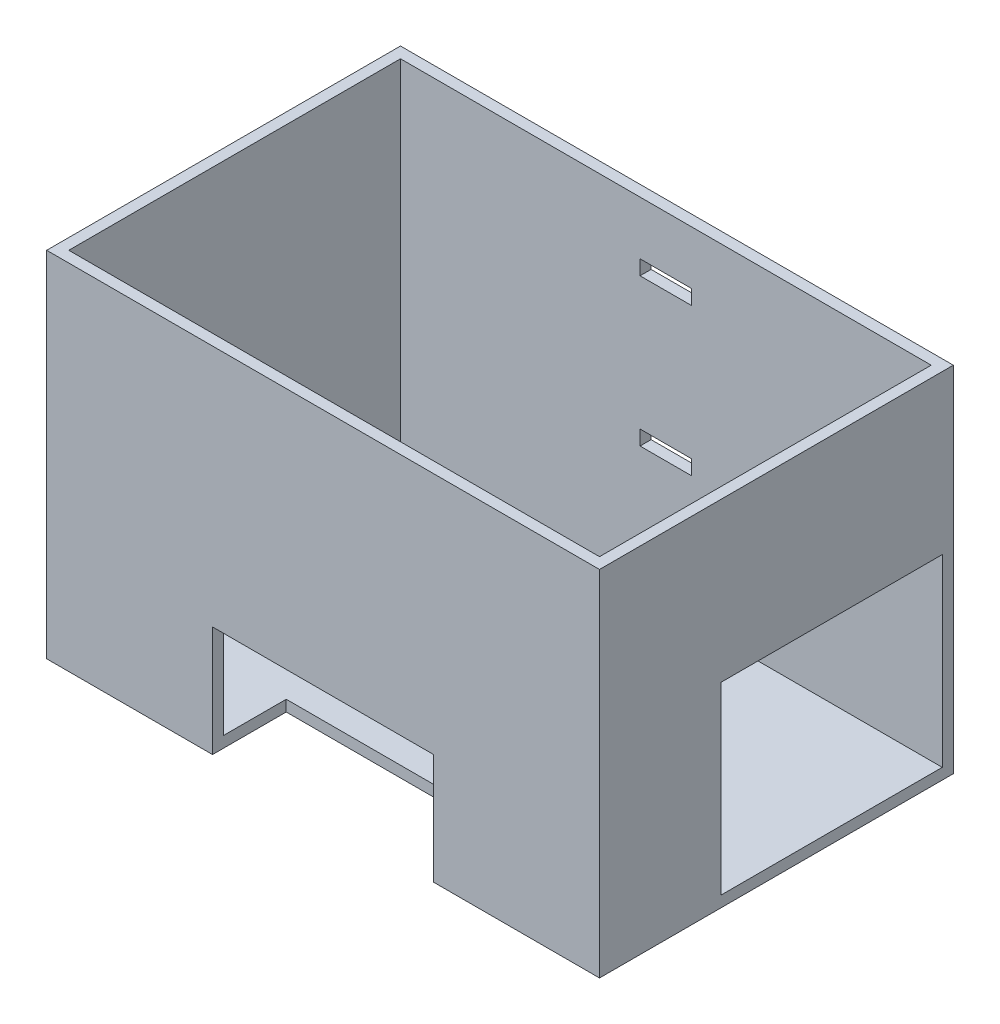
ISO-10303-21;
HEADER;
FILE_DESCRIPTION(('STEP AP214'),'2;1');
FILE_NAME('part.step','',(''),(''),'','','');
FILE_SCHEMA(('AUTOMOTIVE_DESIGN { 1 0 10303 214 1 1 1 1 }'));
ENDSEC;
DATA;
#1=APPLICATION_CONTEXT('core data for automotive mechanical design processes');
#2=APPLICATION_PROTOCOL_DEFINITION('international standard','automotive_design',2000,#1);
#3=PRODUCT_CONTEXT('',#1,'mechanical');
#4=PRODUCT('Part','Part','',(#3));
#5=PRODUCT_RELATED_PRODUCT_CATEGORY('part','',(#4));
#6=PRODUCT_DEFINITION_FORMATION('','',#4);
#7=PRODUCT_DEFINITION_CONTEXT('part definition',#1,'design');
#8=PRODUCT_DEFINITION('design','',#6,#7);
#9=PRODUCT_DEFINITION_SHAPE('','',#8);
#10=(LENGTH_UNIT() NAMED_UNIT(*) SI_UNIT(.MILLI.,.METRE.));
#11=(NAMED_UNIT(*) PLANE_ANGLE_UNIT() SI_UNIT($,.RADIAN.));
#12=(NAMED_UNIT(*) SI_UNIT($,.STERADIAN.) SOLID_ANGLE_UNIT());
#13=UNCERTAINTY_MEASURE_WITH_UNIT(LENGTH_MEASURE(1.E-05),#10,'distance_accuracy_value','');
#14=(GEOMETRIC_REPRESENTATION_CONTEXT(3) GLOBAL_UNCERTAINTY_ASSIGNED_CONTEXT((#13)) GLOBAL_UNIT_ASSIGNED_CONTEXT((#10,
#11,#12)) REPRESENTATION_CONTEXT('',''));
#15=CARTESIAN_POINT('',(0.,0.,0.));
#16=DIRECTION('',(0.,0.,1.));
#17=DIRECTION('',(1.,0.,0.));
#18=AXIS2_PLACEMENT_3D('',#15,#16,#17);
#19=CARTESIAN_POINT('',(0.,48.,0.));
#20=DIRECTION('',(0.,-1.,0.));
#21=DIRECTION('',(0.,0.,-1.));
#22=AXIS2_PLACEMENT_3D('',#19,#20,#21);
#23=PLANE('',#22);
#24=DIRECTION('',(0.,0.,1.));
#25=VECTOR('',#24,1.);
#26=CARTESIAN_POINT('',(0.,48.,0.));
#27=LINE('',#26,#25);
#28=CARTESIAN_POINT('',(0.,48.,-48.));
#29=VERTEX_POINT('',#28);
#30=CARTESIAN_POINT('',(0.,48.,0.));
#31=VERTEX_POINT('',#30);
#32=EDGE_CURVE('E381',#29,#31,#27,.T.);
#33=ORIENTED_EDGE('',*,*,#32,.T.);
#34=DIRECTION('',(1.,0.,0.));
#35=VECTOR('',#34,1.);
#36=CARTESIAN_POINT('',(0.,48.,0.));
#37=LINE('',#36,#35);
#38=CARTESIAN_POINT('',(75.,48.,0.));
#39=VERTEX_POINT('',#38);
#40=EDGE_CURVE('E384',#31,#39,#37,.T.);
#41=ORIENTED_EDGE('',*,*,#40,.T.);
#42=DIRECTION('',(0.,0.,-1.));
#43=VECTOR('',#42,1.);
#44=CARTESIAN_POINT('',(75.,48.,0.));
#45=LINE('',#44,#43);
#46=CARTESIAN_POINT('',(75.,48.,-48.));
#47=VERTEX_POINT('',#46);
#48=EDGE_CURVE('E387',#39,#47,#45,.T.);
#49=ORIENTED_EDGE('',*,*,#48,.T.);
#50=DIRECTION('',(-1.,0.,0.));
#51=VECTOR('',#50,1.);
#52=CARTESIAN_POINT('',(0.,48.,-48.));
#53=LINE('',#52,#51);
#54=EDGE_CURVE('E389',#47,#29,#53,.T.);
#55=ORIENTED_EDGE('',*,*,#54,.T.);
#56=EDGE_LOOP('',(#33,#41,#49,#55));
#57=FACE_BOUND('',#56,.T.);
#58=DIRECTION('',(0.,0.,1.));
#59=VECTOR('',#58,1.);
#60=CARTESIAN_POINT('',(1.5,48.,0.));
#61=LINE('',#60,#59);
#62=CARTESIAN_POINT('',(1.5,48.,-46.5));
#63=VERTEX_POINT('',#62);
#64=CARTESIAN_POINT('',(1.5,48.,-1.5));
#65=VERTEX_POINT('',#64);
#66=EDGE_CURVE('E373',#63,#65,#61,.T.);
#67=ORIENTED_EDGE('',*,*,#66,.F.);
#68=DIRECTION('',(-1.,0.,0.));
#69=VECTOR('',#68,1.);
#70=CARTESIAN_POINT('',(0.,48.,-46.5));
#71=LINE('',#70,#69);
#72=CARTESIAN_POINT('',(73.5,48.,-46.5));
#73=VERTEX_POINT('',#72);
#74=EDGE_CURVE('E361',#73,#63,#71,.T.);
#75=ORIENTED_EDGE('',*,*,#74,.F.);
#76=DIRECTION('',(0.,0.,-1.));
#77=VECTOR('',#76,1.);
#78=CARTESIAN_POINT('',(73.5,48.,0.));
#79=LINE('',#78,#77);
#80=CARTESIAN_POINT('',(73.5,48.,-1.5));
#81=VERTEX_POINT('',#80);
#82=EDGE_CURVE('E377',#81,#73,#79,.T.);
#83=ORIENTED_EDGE('',*,*,#82,.F.);
#84=DIRECTION('',(1.,0.,0.));
#85=VECTOR('',#84,1.);
#86=CARTESIAN_POINT('',(0.,48.,-1.5));
#87=LINE('',#86,#85);
#88=EDGE_CURVE('E375',#65,#81,#87,.T.);
#89=ORIENTED_EDGE('',*,*,#88,.F.);
#90=EDGE_LOOP('',(#67,#75,#83,#89));
#91=FACE_BOUND('',#90,.T.);
#92=ADVANCED_FACE('F40',(#57,#91),#23,.F.);
#93=CARTESIAN_POINT('',(0.,48.,0.));
#94=DIRECTION('',(1.,0.,0.));
#95=DIRECTION('',(0.,0.,-1.));
#96=AXIS2_PLACEMENT_3D('',#93,#94,#95);
#97=PLANE('',#96);
#98=DIRECTION('',(0.,0.,1.));
#99=VECTOR('',#98,1.);
#100=CARTESIAN_POINT('',(0.,1.5,-21.5));
#101=LINE('',#100,#99);
#102=CARTESIAN_POINT('',(0.,1.5,-21.5));
#103=VERTEX_POINT('',#102);
#104=CARTESIAN_POINT('',(0.,1.5,-1.5));
#105=VERTEX_POINT('',#104);
#106=EDGE_CURVE('E277',#103,#105,#101,.T.);
#107=ORIENTED_EDGE('',*,*,#106,.F.);
#108=DIRECTION('',(0.,-1.,0.));
#109=VECTOR('',#108,1.);
#110=CARTESIAN_POINT('',(0.,1.5,-21.5));
#111=LINE('',#110,#109);
#112=CARTESIAN_POINT('',(0.,26.5,-21.5));
#113=VERTEX_POINT('',#112);
#114=EDGE_CURVE('E255',#113,#103,#111,.T.);
#115=ORIENTED_EDGE('',*,*,#114,.F.);
#116=DIRECTION('',(0.,0.,-1.));
#117=VECTOR('',#116,1.);
#118=CARTESIAN_POINT('',(0.,26.5,-21.5));
#119=LINE('',#118,#117);
#120=CARTESIAN_POINT('',(0.,26.5,-1.5));
#121=VERTEX_POINT('',#120);
#122=EDGE_CURVE('E283',#121,#113,#119,.T.);
#123=ORIENTED_EDGE('',*,*,#122,.F.);
#124=DIRECTION('',(0.,1.,0.));
#125=VECTOR('',#124,1.);
#126=CARTESIAN_POINT('',(0.,1.5,-1.5));
#127=LINE('',#126,#125);
#128=EDGE_CURVE('E280',#105,#121,#127,.T.);
#129=ORIENTED_EDGE('',*,*,#128,.F.);
#130=EDGE_LOOP('',(#107,#115,#123,#129));
#131=FACE_BOUND('',#130,.T.);
#132=DIRECTION('',(0.,0.,1.));
#133=VECTOR('',#132,1.);
#134=CARTESIAN_POINT('',(0.,0.,0.));
#135=LINE('',#134,#133);
#136=CARTESIAN_POINT('',(0.,0.,-48.));
#137=VERTEX_POINT('',#136);
#138=CARTESIAN_POINT('',(0.,0.,0.));
#139=VERTEX_POINT('',#138);
#140=EDGE_CURVE('E355',#137,#139,#135,.T.);
#141=ORIENTED_EDGE('',*,*,#140,.T.);
#142=DIRECTION('',(0.,-1.,0.));
#143=VECTOR('',#142,1.);
#144=CARTESIAN_POINT('',(0.,48.,0.));
#145=LINE('',#144,#143);
#146=EDGE_CURVE('E409',#31,#139,#145,.T.);
#147=ORIENTED_EDGE('',*,*,#146,.F.);
#148=ORIENTED_EDGE('',*,*,#32,.F.);
#149=DIRECTION('',(0.,-1.,0.));
#150=VECTOR('',#149,1.);
#151=CARTESIAN_POINT('',(0.,48.,-48.));
#152=LINE('',#151,#150);
#153=EDGE_CURVE('E391',#29,#137,#152,.T.);
#154=ORIENTED_EDGE('',*,*,#153,.T.);
#155=EDGE_LOOP('',(#141,#147,#148,#154));
#156=FACE_BOUND('',#155,.T.);
#157=ADVANCED_FACE('F42',(#131,#156),#97,.F.);
#158=CARTESIAN_POINT('',(0.,48.,0.));
#159=DIRECTION('',(0.,0.,-1.));
#160=DIRECTION('',(-1.,0.,0.));
#161=AXIS2_PLACEMENT_3D('',#158,#159,#160);
#162=PLANE('',#161);
#163=DIRECTION('',(1.,0.,0.));
#164=VECTOR('',#163,1.);
#165=CARTESIAN_POINT('',(0.,0.,0.));
#166=LINE('',#165,#164);
#167=CARTESIAN_POINT('',(22.5,0.,0.));
#168=VERTEX_POINT('',#167);
#169=EDGE_CURVE('E395',#139,#168,#166,.T.);
#170=ORIENTED_EDGE('',*,*,#169,.T.);
#171=DIRECTION('',(0.,-1.,0.));
#172=VECTOR('',#171,1.);
#173=CARTESIAN_POINT('',(22.5,15.,0.));
#174=LINE('',#173,#172);
#175=CARTESIAN_POINT('',(22.5,15.,0.));
#176=VERTEX_POINT('',#175);
#177=EDGE_CURVE('E313',#176,#168,#174,.T.);
#178=ORIENTED_EDGE('',*,*,#177,.F.);
#179=DIRECTION('',(-1.,0.,0.));
#180=VECTOR('',#179,1.);
#181=CARTESIAN_POINT('',(22.5,15.,0.));
#182=LINE('',#181,#180);
#183=CARTESIAN_POINT('',(52.5,15.,0.));
#184=VERTEX_POINT('',#183);
#185=EDGE_CURVE('E304',#184,#176,#182,.T.);
#186=ORIENTED_EDGE('',*,*,#185,.F.);
#187=DIRECTION('',(0.,-1.,0.));
#188=VECTOR('',#187,1.);
#189=CARTESIAN_POINT('',(52.5,15.,0.));
#190=LINE('',#189,#188);
#191=CARTESIAN_POINT('',(52.5,0.,0.));
#192=VERTEX_POINT('',#191);
#193=EDGE_CURVE('E316',#184,#192,#190,.T.);
#194=ORIENTED_EDGE('',*,*,#193,.T.);
#195=CARTESIAN_POINT('',(75.,0.,0.));
#196=VERTEX_POINT('',#195);
#197=EDGE_CURVE('E394',#192,#196,#166,.T.);
#198=ORIENTED_EDGE('',*,*,#197,.T.);
#199=DIRECTION('',(0.,-1.,0.));
#200=VECTOR('',#199,1.);
#201=CARTESIAN_POINT('',(75.,48.,0.));
#202=LINE('',#201,#200);
#203=EDGE_CURVE('E406',#39,#196,#202,.T.);
#204=ORIENTED_EDGE('',*,*,#203,.F.);
#205=ORIENTED_EDGE('',*,*,#40,.F.);
#206=ORIENTED_EDGE('',*,*,#146,.T.);
#207=EDGE_LOOP('',(#170,#178,#186,#194,#198,#204,#205,#206));
#208=FACE_BOUND('',#207,.T.);
#209=ADVANCED_FACE('F462',(#208),#162,.F.);
#210=CARTESIAN_POINT('',(75.,48.,0.));
#211=DIRECTION('',(-1.,0.,0.));
#212=DIRECTION('',(0.,0.,1.));
#213=AXIS2_PLACEMENT_3D('',#210,#211,#212);
#214=PLANE('',#213);
#215=DIRECTION('',(0.,0.,-1.));
#216=VECTOR('',#215,1.);
#217=CARTESIAN_POINT('',(75.,1.5,-16.5));
#218=LINE('',#217,#216);
#219=CARTESIAN_POINT('',(75.,1.5,-16.5));
#220=VERTEX_POINT('',#219);
#221=CARTESIAN_POINT('',(75.,1.5,-46.5));
#222=VERTEX_POINT('',#221);
#223=EDGE_CURVE('E328',#220,#222,#218,.T.);
#224=ORIENTED_EDGE('',*,*,#223,.F.);
#225=DIRECTION('',(0.,-1.,0.));
#226=VECTOR('',#225,1.);
#227=CARTESIAN_POINT('',(75.,26.5,-16.5));
#228=LINE('',#227,#226);
#229=CARTESIAN_POINT('',(75.,26.5,-16.5));
#230=VERTEX_POINT('',#229);
#231=EDGE_CURVE('E326',#230,#220,#228,.T.);
#232=ORIENTED_EDGE('',*,*,#231,.F.);
#233=DIRECTION('',(0.,0.,1.));
#234=VECTOR('',#233,1.);
#235=CARTESIAN_POINT('',(75.,26.5,-16.5));
#236=LINE('',#235,#234);
#237=CARTESIAN_POINT('',(75.,26.5,-46.5));
#238=VERTEX_POINT('',#237);
#239=EDGE_CURVE('E334',#238,#230,#236,.T.);
#240=ORIENTED_EDGE('',*,*,#239,.F.);
#241=DIRECTION('',(0.,1.,0.));
#242=VECTOR('',#241,1.);
#243=CARTESIAN_POINT('',(75.,26.5,-46.5));
#244=LINE('',#243,#242);
#245=EDGE_CURVE('E331',#222,#238,#244,.T.);
#246=ORIENTED_EDGE('',*,*,#245,.F.);
#247=EDGE_LOOP('',(#224,#232,#240,#246));
#248=FACE_BOUND('',#247,.T.);
#249=DIRECTION('',(0.,0.,-1.));
#250=VECTOR('',#249,1.);
#251=CARTESIAN_POINT('',(75.,0.,0.));
#252=LINE('',#251,#250);
#253=CARTESIAN_POINT('',(75.,0.,-48.));
#254=VERTEX_POINT('',#253);
#255=EDGE_CURVE('E398',#196,#254,#252,.T.);
#256=ORIENTED_EDGE('',*,*,#255,.T.);
#257=DIRECTION('',(0.,-1.,0.));
#258=VECTOR('',#257,1.);
#259=CARTESIAN_POINT('',(75.,48.,-48.));
#260=LINE('',#259,#258);
#261=EDGE_CURVE('E403',#47,#254,#260,.T.);
#262=ORIENTED_EDGE('',*,*,#261,.F.);
#263=ORIENTED_EDGE('',*,*,#48,.F.);
#264=ORIENTED_EDGE('',*,*,#203,.T.);
#265=EDGE_LOOP('',(#256,#262,#263,#264));
#266=FACE_BOUND('',#265,.T.);
#267=ADVANCED_FACE('F476',(#248,#266),#214,.F.);
#268=CARTESIAN_POINT('',(0.,48.,-48.));
#269=DIRECTION('',(0.,0.,1.));
#270=DIRECTION('',(1.,0.,0.));
#271=AXIS2_PLACEMENT_3D('',#268,#269,#270);
#272=PLANE('',#271);
#273=DIRECTION('',(-1.,0.,0.));
#274=VECTOR('',#273,1.);
#275=CARTESIAN_POINT('',(41.,18.75,-48.));
#276=LINE('',#275,#274);
#277=CARTESIAN_POINT('',(41.,18.75,-48.));
#278=VERTEX_POINT('',#277);
#279=CARTESIAN_POINT('',(34.,18.75,-48.));
#280=VERTEX_POINT('',#279);
#281=EDGE_CURVE('E241',#278,#280,#276,.T.);
#282=ORIENTED_EDGE('',*,*,#281,.F.);
#283=DIRECTION('',(0.,-1.,0.));
#284=VECTOR('',#283,1.);
#285=CARTESIAN_POINT('',(41.,20.75,-48.));
#286=LINE('',#285,#284);
#287=CARTESIAN_POINT('',(41.,20.75,-48.));
#288=VERTEX_POINT('',#287);
#289=EDGE_CURVE('E55',#288,#278,#286,.T.);
#290=ORIENTED_EDGE('',*,*,#289,.F.);
#291=DIRECTION('',(1.,0.,0.));
#292=VECTOR('',#291,1.);
#293=CARTESIAN_POINT('',(41.,20.75,-48.));
#294=LINE('',#293,#292);
#295=CARTESIAN_POINT('',(34.,20.75,-48.));
#296=VERTEX_POINT('',#295);
#297=EDGE_CURVE('E248',#296,#288,#294,.T.);
#298=ORIENTED_EDGE('',*,*,#297,.F.);
#299=DIRECTION('',(0.,1.,0.));
#300=VECTOR('',#299,1.);
#301=CARTESIAN_POINT('',(34.,20.75,-48.));
#302=LINE('',#301,#300);
#303=EDGE_CURVE('E231',#280,#296,#302,.T.);
#304=ORIENTED_EDGE('',*,*,#303,.F.);
#305=EDGE_LOOP('',(#282,#290,#298,#304));
#306=FACE_BOUND('',#305,.T.);
#307=DIRECTION('',(0.,-1.,0.));
#308=VECTOR('',#307,1.);
#309=CARTESIAN_POINT('',(41.0000000000001,40.75,-48.));
#310=LINE('',#309,#308);
#311=CARTESIAN_POINT('',(41.0000000000001,40.75,-48.));
#312=VERTEX_POINT('',#311);
#313=CARTESIAN_POINT('',(41.0000000000001,38.75,-48.));
#314=VERTEX_POINT('',#313);
#315=EDGE_CURVE('E259',#312,#314,#310,.T.);
#316=ORIENTED_EDGE('',*,*,#315,.F.);
#317=DIRECTION('',(1.,0.,0.));
#318=VECTOR('',#317,1.);
#319=CARTESIAN_POINT('',(41.0000000000001,40.75,-48.));
#320=LINE('',#319,#318);
#321=CARTESIAN_POINT('',(34.0000000000001,40.75,-48.));
#322=VERTEX_POINT('',#321);
#323=EDGE_CURVE('E63',#322,#312,#320,.T.);
#324=ORIENTED_EDGE('',*,*,#323,.F.);
#325=DIRECTION('',(0.,1.,0.));
#326=VECTOR('',#325,1.);
#327=CARTESIAN_POINT('',(34.0000000000001,40.75,-48.));
#328=LINE('',#327,#326);
#329=CARTESIAN_POINT('',(34.0000000000001,38.75,-48.));
#330=VERTEX_POINT('',#329);
#331=EDGE_CURVE('E265',#330,#322,#328,.T.);
#332=ORIENTED_EDGE('',*,*,#331,.F.);
#333=DIRECTION('',(-1.,0.,0.));
#334=VECTOR('',#333,1.);
#335=CARTESIAN_POINT('',(41.0000000000001,38.75,-48.));
#336=LINE('',#335,#334);
#337=EDGE_CURVE('E262',#314,#330,#336,.T.);
#338=ORIENTED_EDGE('',*,*,#337,.F.);
#339=EDGE_LOOP('',(#316,#324,#332,#338));
#340=FACE_BOUND('',#339,.T.);
#341=DIRECTION('',(-1.,0.,0.));
#342=VECTOR('',#341,1.);
#343=CARTESIAN_POINT('',(0.,0.,-48.));
#344=LINE('',#343,#342);
#345=EDGE_CURVE('E385',#254,#137,#344,.T.);
#346=ORIENTED_EDGE('',*,*,#345,.T.);
#347=ORIENTED_EDGE('',*,*,#153,.F.);
#348=ORIENTED_EDGE('',*,*,#54,.F.);
#349=ORIENTED_EDGE('',*,*,#261,.T.);
#350=EDGE_LOOP('',(#346,#347,#348,#349));
#351=FACE_BOUND('',#350,.T.);
#352=ADVANCED_FACE('F245',(#306,#340,#351),#272,.F.);
#353=CARTESIAN_POINT('',(0.,0.,0.));
#354=DIRECTION('',(0.,-1.,0.));
#355=DIRECTION('',(0.,0.,-1.));
#356=AXIS2_PLACEMENT_3D('',#353,#354,#355);
#357=PLANE('',#356);
#358=DIRECTION('',(0.,0.,-1.));
#359=VECTOR('',#358,1.);
#360=CARTESIAN_POINT('',(22.5,0.,-10.));
#361=LINE('',#360,#359);
#362=CARTESIAN_POINT('',(22.5,0.,-10.));
#363=VERTEX_POINT('',#362);
#364=EDGE_CURVE('E297',#168,#363,#361,.T.);
#365=ORIENTED_EDGE('',*,*,#364,.F.);
#366=ORIENTED_EDGE('',*,*,#169,.F.);
#367=ORIENTED_EDGE('',*,*,#140,.F.);
#368=ORIENTED_EDGE('',*,*,#345,.F.);
#369=ORIENTED_EDGE('',*,*,#255,.F.);
#370=ORIENTED_EDGE('',*,*,#197,.F.);
#371=DIRECTION('',(0.,0.,1.));
#372=VECTOR('',#371,1.);
#373=CARTESIAN_POINT('',(52.5,0.,-10.));
#374=LINE('',#373,#372);
#375=CARTESIAN_POINT('',(52.5,0.,-10.));
#376=VERTEX_POINT('',#375);
#377=EDGE_CURVE('E302',#376,#192,#374,.T.);
#378=ORIENTED_EDGE('',*,*,#377,.F.);
#379=DIRECTION('',(1.,0.,0.));
#380=VECTOR('',#379,1.);
#381=CARTESIAN_POINT('',(22.5,0.,-10.));
#382=LINE('',#381,#380);
#383=EDGE_CURVE('E309',#363,#376,#382,.T.);
#384=ORIENTED_EDGE('',*,*,#383,.F.);
#385=EDGE_LOOP('',(#365,#366,#367,#368,#369,#370,#378,#384));
#386=FACE_BOUND('',#385,.T.);
#387=ADVANCED_FACE('F469',(#386),#357,.T.);
#388=CARTESIAN_POINT('',(1.5,48.,0.));
#389=DIRECTION('',(1.,0.,0.));
#390=DIRECTION('',(0.,0.,-1.));
#391=AXIS2_PLACEMENT_3D('',#388,#389,#390);
#392=PLANE('',#391);
#393=DIRECTION('',(0.,1.,0.));
#394=VECTOR('',#393,1.);
#395=CARTESIAN_POINT('',(1.5,48.,-21.5));
#396=LINE('',#395,#394);
#397=CARTESIAN_POINT('',(1.5,1.5,-21.5));
#398=VERTEX_POINT('',#397);
#399=CARTESIAN_POINT('',(1.5,26.5,-21.5));
#400=VERTEX_POINT('',#399);
#401=EDGE_CURVE('E289',#398,#400,#396,.T.);
#402=ORIENTED_EDGE('',*,*,#401,.F.);
#403=DIRECTION('',(0.,0.,1.));
#404=VECTOR('',#403,1.);
#405=CARTESIAN_POINT('',(1.5,1.5,0.));
#406=LINE('',#405,#404);
#407=CARTESIAN_POINT('',(1.5,1.5,-46.5));
#408=VERTEX_POINT('',#407);
#409=EDGE_CURVE('E348',#408,#398,#406,.T.);
#410=ORIENTED_EDGE('',*,*,#409,.F.);
#411=DIRECTION('',(0.,-1.,0.));
#412=VECTOR('',#411,1.);
#413=CARTESIAN_POINT('',(1.5,48.,-46.5));
#414=LINE('',#413,#412);
#415=EDGE_CURVE('E357',#63,#408,#414,.T.);
#416=ORIENTED_EDGE('',*,*,#415,.F.);
#417=ORIENTED_EDGE('',*,*,#66,.T.);
#418=DIRECTION('',(0.,-1.,0.));
#419=VECTOR('',#418,1.);
#420=CARTESIAN_POINT('',(1.5,48.,-1.5));
#421=LINE('',#420,#419);
#422=CARTESIAN_POINT('',(1.5,26.5,-1.5));
#423=VERTEX_POINT('',#422);
#424=EDGE_CURVE('E352',#65,#423,#421,.T.);
#425=ORIENTED_EDGE('',*,*,#424,.T.);
#426=DIRECTION('',(0.,0.,1.));
#427=VECTOR('',#426,1.);
#428=CARTESIAN_POINT('',(1.5,26.5,0.));
#429=LINE('',#428,#427);
#430=EDGE_CURVE('E295',#400,#423,#429,.T.);
#431=ORIENTED_EDGE('',*,*,#430,.F.);
#432=EDGE_LOOP('',(#402,#410,#416,#417,#425,#431));
#433=FACE_BOUND('',#432,.T.);
#434=ADVANCED_FACE('F472',(#433),#392,.T.);
#435=CARTESIAN_POINT('',(0.,48.,-1.5));
#436=DIRECTION('',(0.,0.,-1.));
#437=DIRECTION('',(-1.,0.,0.));
#438=AXIS2_PLACEMENT_3D('',#435,#436,#437);
#439=PLANE('',#438);
#440=DIRECTION('',(1.,0.,0.));
#441=VECTOR('',#440,1.);
#442=CARTESIAN_POINT('',(0.,1.5,-1.5));
#443=LINE('',#442,#441);
#444=CARTESIAN_POINT('',(22.5,1.5,-1.5));
#445=VERTEX_POINT('',#444);
#446=EDGE_CURVE('E362',#105,#445,#443,.T.);
#447=ORIENTED_EDGE('',*,*,#446,.F.);
#448=ORIENTED_EDGE('',*,*,#128,.T.);
#449=DIRECTION('',(-1.,0.,0.));
#450=VECTOR('',#449,1.);
#451=CARTESIAN_POINT('',(15.,26.5,-1.5));
#452=LINE('',#451,#450);
#453=EDGE_CURVE('E290',#423,#121,#452,.T.);
#454=ORIENTED_EDGE('',*,*,#453,.F.);
#455=ORIENTED_EDGE('',*,*,#424,.F.);
#456=ORIENTED_EDGE('',*,*,#88,.T.);
#457=DIRECTION('',(0.,-1.,0.));
#458=VECTOR('',#457,1.);
#459=CARTESIAN_POINT('',(73.5,48.,-1.5));
#460=LINE('',#459,#458);
#461=CARTESIAN_POINT('',(73.5,1.5,-1.5));
#462=VERTEX_POINT('',#461);
#463=EDGE_CURVE('E356',#81,#462,#460,.T.);
#464=ORIENTED_EDGE('',*,*,#463,.T.);
#465=CARTESIAN_POINT('',(52.5,1.5,-1.5));
#466=VERTEX_POINT('',#465);
#467=EDGE_CURVE('E351',#466,#462,#443,.T.);
#468=ORIENTED_EDGE('',*,*,#467,.F.);
#469=DIRECTION('',(0.,-1.,0.));
#470=VECTOR('',#469,1.);
#471=CARTESIAN_POINT('',(52.5,48.,-1.5));
#472=LINE('',#471,#470);
#473=CARTESIAN_POINT('',(52.5,15.,-1.5));
#474=VERTEX_POINT('',#473);
#475=EDGE_CURVE('E315',#474,#466,#472,.T.);
#476=ORIENTED_EDGE('',*,*,#475,.F.);
#477=DIRECTION('',(1.,0.,0.));
#478=VECTOR('',#477,1.);
#479=CARTESIAN_POINT('',(0.,15.,-1.5));
#480=LINE('',#479,#478);
#481=CARTESIAN_POINT('',(22.5,15.,-1.5));
#482=VERTEX_POINT('',#481);
#483=EDGE_CURVE('E421',#482,#474,#480,.T.);
#484=ORIENTED_EDGE('',*,*,#483,.F.);
#485=DIRECTION('',(0.,1.,0.));
#486=VECTOR('',#485,1.);
#487=CARTESIAN_POINT('',(22.5,48.,-1.5));
#488=LINE('',#487,#486);
#489=EDGE_CURVE('E324',#445,#482,#488,.T.);
#490=ORIENTED_EDGE('',*,*,#489,.F.);
#491=EDGE_LOOP('',(#447,#448,#454,#455,#456,#464,#468,#476,#484,#490));
#492=FACE_BOUND('',#491,.T.);
#493=ADVANCED_FACE('F503',(#492),#439,.T.);
#494=CARTESIAN_POINT('',(73.5,48.,0.));
#495=DIRECTION('',(-1.,0.,0.));
#496=DIRECTION('',(0.,0.,1.));
#497=AXIS2_PLACEMENT_3D('',#494,#495,#496);
#498=PLANE('',#497);
#499=DIRECTION('',(0.,1.,0.));
#500=VECTOR('',#499,1.);
#501=CARTESIAN_POINT('',(73.5,48.,-16.5));
#502=LINE('',#501,#500);
#503=CARTESIAN_POINT('',(73.5,1.5,-16.5));
#504=VERTEX_POINT('',#503);
#505=CARTESIAN_POINT('',(73.5,26.5,-16.5));
#506=VERTEX_POINT('',#505);
#507=EDGE_CURVE('E340',#504,#506,#502,.T.);
#508=ORIENTED_EDGE('',*,*,#507,.F.);
#509=DIRECTION('',(0.,0.,-1.));
#510=VECTOR('',#509,1.);
#511=CARTESIAN_POINT('',(73.5,1.5,0.));
#512=LINE('',#511,#510);
#513=EDGE_CURVE('E364',#462,#504,#512,.T.);
#514=ORIENTED_EDGE('',*,*,#513,.F.);
#515=ORIENTED_EDGE('',*,*,#463,.F.);
#516=ORIENTED_EDGE('',*,*,#82,.T.);
#517=DIRECTION('',(0.,-1.,0.));
#518=VECTOR('',#517,1.);
#519=CARTESIAN_POINT('',(73.5,48.,-46.5));
#520=LINE('',#519,#518);
#521=CARTESIAN_POINT('',(73.5,26.5,-46.5));
#522=VERTEX_POINT('',#521);
#523=EDGE_CURVE('E360',#73,#522,#520,.T.);
#524=ORIENTED_EDGE('',*,*,#523,.T.);
#525=DIRECTION('',(0.,0.,-1.));
#526=VECTOR('',#525,1.);
#527=CARTESIAN_POINT('',(73.5,26.5,0.));
#528=LINE('',#527,#526);
#529=EDGE_CURVE('E346',#506,#522,#528,.T.);
#530=ORIENTED_EDGE('',*,*,#529,.F.);
#531=EDGE_LOOP('',(#508,#514,#515,#516,#524,#530));
#532=FACE_BOUND('',#531,.T.);
#533=ADVANCED_FACE('F548',(#532),#498,.T.);
#534=CARTESIAN_POINT('',(0.,48.,-46.5));
#535=DIRECTION('',(0.,0.,1.));
#536=DIRECTION('',(1.,0.,0.));
#537=AXIS2_PLACEMENT_3D('',#534,#535,#536);
#538=PLANE('',#537);
#539=DIRECTION('',(0.,1.,0.));
#540=VECTOR('',#539,1.);
#541=CARTESIAN_POINT('',(41.0000000000001,47.9999999999999,-46.5));
#542=LINE('',#541,#540);
#543=CARTESIAN_POINT('',(41.,18.75,-46.5));
#544=VERTEX_POINT('',#543);
#545=CARTESIAN_POINT('',(41.,20.75,-46.5));
#546=VERTEX_POINT('',#545);
#547=EDGE_CURVE('E11',#544,#546,#542,.T.);
#548=ORIENTED_EDGE('',*,*,#547,.F.);
#549=DIRECTION('',(1.,0.,0.));
#550=VECTOR('',#549,1.);
#551=CARTESIAN_POINT('',(0.,18.75,-46.5));
#552=LINE('',#551,#550);
#553=CARTESIAN_POINT('',(34.,18.75,-46.5));
#554=VERTEX_POINT('',#553);
#555=EDGE_CURVE('E432',#554,#544,#552,.T.);
#556=ORIENTED_EDGE('',*,*,#555,.F.);
#557=DIRECTION('',(0.,-1.,0.));
#558=VECTOR('',#557,1.);
#559=CARTESIAN_POINT('',(34.,48.,-46.5));
#560=LINE('',#559,#558);
#561=CARTESIAN_POINT('',(34.,20.75,-46.5));
#562=VERTEX_POINT('',#561);
#563=EDGE_CURVE('E234',#562,#554,#560,.T.);
#564=ORIENTED_EDGE('',*,*,#563,.F.);
#565=DIRECTION('',(-1.,0.,0.));
#566=VECTOR('',#565,1.);
#567=CARTESIAN_POINT('',(0.,20.75,-46.5));
#568=LINE('',#567,#566);
#569=EDGE_CURVE('E48',#546,#562,#568,.T.);
#570=ORIENTED_EDGE('',*,*,#569,.F.);
#571=EDGE_LOOP('',(#548,#556,#564,#570));
#572=FACE_BOUND('',#571,.T.);
#573=DIRECTION('',(-1.,0.,0.));
#574=VECTOR('',#573,1.);
#575=CARTESIAN_POINT('',(0.,40.75,-46.5));
#576=LINE('',#575,#574);
#577=CARTESIAN_POINT('',(41.0000000000001,40.75,-46.5));
#578=VERTEX_POINT('',#577);
#579=CARTESIAN_POINT('',(34.0000000000001,40.75,-46.5));
#580=VERTEX_POINT('',#579);
#581=EDGE_CURVE('E430',#578,#580,#576,.T.);
#582=ORIENTED_EDGE('',*,*,#581,.F.);
#583=DIRECTION('',(0.,1.,0.));
#584=VECTOR('',#583,1.);
#585=CARTESIAN_POINT('',(41.0000000000001,47.9999999999999,-46.5));
#586=LINE('',#585,#584);
#587=CARTESIAN_POINT('',(41.0000000000001,38.75,-46.5));
#588=VERTEX_POINT('',#587);
#589=EDGE_CURVE('E423',#588,#578,#586,.T.);
#590=ORIENTED_EDGE('',*,*,#589,.F.);
#591=DIRECTION('',(1.,0.,0.));
#592=VECTOR('',#591,1.);
#593=CARTESIAN_POINT('',(0.,38.75,-46.5));
#594=LINE('',#593,#592);
#595=CARTESIAN_POINT('',(34.0000000000001,38.75,-46.5));
#596=VERTEX_POINT('',#595);
#597=EDGE_CURVE('E425',#596,#588,#594,.T.);
#598=ORIENTED_EDGE('',*,*,#597,.F.);
#599=DIRECTION('',(0.,-1.,0.));
#600=VECTOR('',#599,1.);
#601=CARTESIAN_POINT('',(34.0000000000001,48.,-46.5));
#602=LINE('',#601,#600);
#603=EDGE_CURVE('E428',#580,#596,#602,.T.);
#604=ORIENTED_EDGE('',*,*,#603,.F.);
#605=EDGE_LOOP('',(#582,#590,#598,#604));
#606=FACE_BOUND('',#605,.T.);
#607=DIRECTION('',(-1.,0.,0.));
#608=VECTOR('',#607,1.);
#609=CARTESIAN_POINT('',(0.,1.5,-46.5));
#610=LINE('',#609,#608);
#611=EDGE_CURVE('E369',#222,#408,#610,.T.);
#612=ORIENTED_EDGE('',*,*,#611,.F.);
#613=ORIENTED_EDGE('',*,*,#245,.T.);
#614=DIRECTION('',(1.,0.,0.));
#615=VECTOR('',#614,1.);
#616=CARTESIAN_POINT('',(25.,26.5,-46.5));
#617=LINE('',#616,#615);
#618=EDGE_CURVE('E341',#522,#238,#617,.T.);
#619=ORIENTED_EDGE('',*,*,#618,.F.);
#620=ORIENTED_EDGE('',*,*,#523,.F.);
#621=ORIENTED_EDGE('',*,*,#74,.T.);
#622=ORIENTED_EDGE('',*,*,#415,.T.);
#623=EDGE_LOOP('',(#612,#613,#619,#620,#621,#622));
#624=FACE_BOUND('',#623,.T.);
#625=ADVANCED_FACE('F440',(#572,#606,#624),#538,.T.);
#626=CARTESIAN_POINT('',(0.,1.5,0.));
#627=DIRECTION('',(0.,-1.,0.));
#628=DIRECTION('',(0.,0.,-1.));
#629=AXIS2_PLACEMENT_3D('',#626,#627,#628);
#630=PLANE('',#629);
#631=ORIENTED_EDGE('',*,*,#409,.T.);
#632=DIRECTION('',(-1.,0.,0.));
#633=VECTOR('',#632,1.);
#634=CARTESIAN_POINT('',(15.,1.5,-21.5));
#635=LINE('',#634,#633);
#636=EDGE_CURVE('E286',#398,#103,#635,.T.);
#637=ORIENTED_EDGE('',*,*,#636,.T.);
#638=ORIENTED_EDGE('',*,*,#106,.T.);
#639=ORIENTED_EDGE('',*,*,#446,.T.);
#640=DIRECTION('',(0.,0.,-1.));
#641=VECTOR('',#640,1.);
#642=CARTESIAN_POINT('',(22.5,1.5,0.));
#643=LINE('',#642,#641);
#644=CARTESIAN_POINT('',(22.5,1.5,-10.));
#645=VERTEX_POINT('',#644);
#646=EDGE_CURVE('E418',#445,#645,#643,.T.);
#647=ORIENTED_EDGE('',*,*,#646,.T.);
#648=DIRECTION('',(1.,0.,0.));
#649=VECTOR('',#648,1.);
#650=CARTESIAN_POINT('',(0.,1.5,-10.));
#651=LINE('',#650,#649);
#652=CARTESIAN_POINT('',(52.5,1.5,-10.));
#653=VERTEX_POINT('',#652);
#654=EDGE_CURVE('E412',#645,#653,#651,.T.);
#655=ORIENTED_EDGE('',*,*,#654,.T.);
#656=DIRECTION('',(0.,0.,1.));
#657=VECTOR('',#656,1.);
#658=CARTESIAN_POINT('',(52.5,1.5,0.));
#659=LINE('',#658,#657);
#660=EDGE_CURVE('E415',#653,#466,#659,.T.);
#661=ORIENTED_EDGE('',*,*,#660,.T.);
#662=ORIENTED_EDGE('',*,*,#467,.T.);
#663=ORIENTED_EDGE('',*,*,#513,.T.);
#664=DIRECTION('',(1.,0.,0.));
#665=VECTOR('',#664,1.);
#666=CARTESIAN_POINT('',(25.,1.5,-16.5));
#667=LINE('',#666,#665);
#668=EDGE_CURVE('E337',#504,#220,#667,.T.);
#669=ORIENTED_EDGE('',*,*,#668,.T.);
#670=ORIENTED_EDGE('',*,*,#223,.T.);
#671=ORIENTED_EDGE('',*,*,#611,.T.);
#672=EDGE_LOOP('',(#631,#637,#638,#639,#647,#655,#661,#662,#663,#669,#670,#671));
#673=FACE_BOUND('',#672,.T.);
#674=ADVANCED_FACE('F467',(#673),#630,.F.);
#675=CARTESIAN_POINT('',(25.,26.5,-16.5));
#676=DIRECTION('',(0.,0.,1.));
#677=DIRECTION('',(0.,-1.,0.));
#678=AXIS2_PLACEMENT_3D('',#675,#676,#677);
#679=PLANE('',#678);
#680=ORIENTED_EDGE('',*,*,#507,.T.);
#681=DIRECTION('',(1.,0.,0.));
#682=VECTOR('',#681,1.);
#683=CARTESIAN_POINT('',(25.,26.5,-16.5));
#684=LINE('',#683,#682);
#685=EDGE_CURVE('E338',#506,#230,#684,.T.);
#686=ORIENTED_EDGE('',*,*,#685,.T.);
#687=ORIENTED_EDGE('',*,*,#231,.T.);
#688=ORIENTED_EDGE('',*,*,#668,.F.);
#689=EDGE_LOOP('',(#680,#686,#687,#688));
#690=FACE_BOUND('',#689,.T.);
#691=ADVANCED_FACE('F538',(#690),#679,.F.);
#692=CARTESIAN_POINT('',(25.,26.5,-16.5));
#693=DIRECTION('',(0.,1.,0.));
#694=DIRECTION('',(0.,0.,1.));
#695=AXIS2_PLACEMENT_3D('',#692,#693,#694);
#696=PLANE('',#695);
#697=ORIENTED_EDGE('',*,*,#529,.T.);
#698=ORIENTED_EDGE('',*,*,#618,.T.);
#699=ORIENTED_EDGE('',*,*,#239,.T.);
#700=ORIENTED_EDGE('',*,*,#685,.F.);
#701=EDGE_LOOP('',(#697,#698,#699,#700));
#702=FACE_BOUND('',#701,.T.);
#703=ADVANCED_FACE('F534',(#702),#696,.F.);
#704=CARTESIAN_POINT('',(22.5,15.,-10.));
#705=DIRECTION('',(0.,0.,-1.));
#706=DIRECTION('',(-1.,0.,0.));
#707=AXIS2_PLACEMENT_3D('',#704,#705,#706);
#708=PLANE('',#707);
#709=DIRECTION('',(0.,-1.,0.));
#710=VECTOR('',#709,1.);
#711=CARTESIAN_POINT('',(22.5,15.,-10.));
#712=LINE('',#711,#710);
#713=EDGE_CURVE('E307',#645,#363,#712,.T.);
#714=ORIENTED_EDGE('',*,*,#713,.T.);
#715=ORIENTED_EDGE('',*,*,#383,.T.);
#716=DIRECTION('',(0.,-1.,0.));
#717=VECTOR('',#716,1.);
#718=CARTESIAN_POINT('',(52.5,15.,-10.));
#719=LINE('',#718,#717);
#720=EDGE_CURVE('E319',#653,#376,#719,.T.);
#721=ORIENTED_EDGE('',*,*,#720,.F.);
#722=ORIENTED_EDGE('',*,*,#654,.F.);
#723=EDGE_LOOP('',(#714,#715,#721,#722));
#724=FACE_BOUND('',#723,.T.);
#725=ADVANCED_FACE('F496',(#724),#708,.F.);
#726=CARTESIAN_POINT('',(22.5,15.,-10.));
#727=DIRECTION('',(-1.,0.,0.));
#728=DIRECTION('',(0.,0.,1.));
#729=AXIS2_PLACEMENT_3D('',#726,#727,#728);
#730=PLANE('',#729);
#731=ORIENTED_EDGE('',*,*,#489,.T.);
#732=DIRECTION('',(0.,0.,-1.));
#733=VECTOR('',#732,1.);
#734=CARTESIAN_POINT('',(22.5,15.,-10.));
#735=LINE('',#734,#733);
#736=EDGE_CURVE('E298',#176,#482,#735,.T.);
#737=ORIENTED_EDGE('',*,*,#736,.F.);
#738=ORIENTED_EDGE('',*,*,#177,.T.);
#739=ORIENTED_EDGE('',*,*,#364,.T.);
#740=ORIENTED_EDGE('',*,*,#713,.F.);
#741=ORIENTED_EDGE('',*,*,#646,.F.);
#742=EDGE_LOOP('',(#731,#737,#738,#739,#740,#741));
#743=FACE_BOUND('',#742,.T.);
#744=ADVANCED_FACE('F493',(#743),#730,.F.);
#745=CARTESIAN_POINT('',(52.5,15.,-10.));
#746=DIRECTION('',(1.,0.,0.));
#747=DIRECTION('',(0.,0.,-1.));
#748=AXIS2_PLACEMENT_3D('',#745,#746,#747);
#749=PLANE('',#748);
#750=ORIENTED_EDGE('',*,*,#475,.T.);
#751=ORIENTED_EDGE('',*,*,#660,.F.);
#752=ORIENTED_EDGE('',*,*,#720,.T.);
#753=ORIENTED_EDGE('',*,*,#377,.T.);
#754=ORIENTED_EDGE('',*,*,#193,.F.);
#755=DIRECTION('',(0.,0.,1.));
#756=VECTOR('',#755,1.);
#757=CARTESIAN_POINT('',(52.5,15.,-10.));
#758=LINE('',#757,#756);
#759=EDGE_CURVE('E301',#474,#184,#758,.T.);
#760=ORIENTED_EDGE('',*,*,#759,.F.);
#761=EDGE_LOOP('',(#750,#751,#752,#753,#754,#760));
#762=FACE_BOUND('',#761,.T.);
#763=ADVANCED_FACE('F510',(#762),#749,.F.);
#764=CARTESIAN_POINT('',(0.,15.,0.));
#765=DIRECTION('',(0.,1.,0.));
#766=DIRECTION('',(0.,0.,1.));
#767=AXIS2_PLACEMENT_3D('',#764,#765,#766);
#768=PLANE('',#767);
#769=ORIENTED_EDGE('',*,*,#483,.T.);
#770=ORIENTED_EDGE('',*,*,#759,.T.);
#771=ORIENTED_EDGE('',*,*,#185,.T.);
#772=ORIENTED_EDGE('',*,*,#736,.T.);
#773=EDGE_LOOP('',(#769,#770,#771,#772));
#774=FACE_BOUND('',#773,.T.);
#775=ADVANCED_FACE('F507',(#774),#768,.F.);
#776=CARTESIAN_POINT('',(15.,1.5,-21.5));
#777=DIRECTION('',(0.,0.,-1.));
#778=DIRECTION('',(-1.,0.,0.));
#779=AXIS2_PLACEMENT_3D('',#776,#777,#778);
#780=PLANE('',#779);
#781=ORIENTED_EDGE('',*,*,#401,.T.);
#782=DIRECTION('',(-1.,0.,0.));
#783=VECTOR('',#782,1.);
#784=CARTESIAN_POINT('',(15.,26.5,-21.5));
#785=LINE('',#784,#783);
#786=EDGE_CURVE('E287',#400,#113,#785,.T.);
#787=ORIENTED_EDGE('',*,*,#786,.T.);
#788=ORIENTED_EDGE('',*,*,#114,.T.);
#789=ORIENTED_EDGE('',*,*,#636,.F.);
#790=EDGE_LOOP('',(#781,#787,#788,#789));
#791=FACE_BOUND('',#790,.T.);
#792=ADVANCED_FACE('F528',(#791),#780,.F.);
#793=CARTESIAN_POINT('',(15.,26.5,-21.5));
#794=DIRECTION('',(0.,1.,0.));
#795=DIRECTION('',(0.,0.,1.));
#796=AXIS2_PLACEMENT_3D('',#793,#794,#795);
#797=PLANE('',#796);
#798=ORIENTED_EDGE('',*,*,#430,.T.);
#799=ORIENTED_EDGE('',*,*,#453,.T.);
#800=ORIENTED_EDGE('',*,*,#122,.T.);
#801=ORIENTED_EDGE('',*,*,#786,.F.);
#802=EDGE_LOOP('',(#798,#799,#800,#801));
#803=FACE_BOUND('',#802,.T.);
#804=ADVANCED_FACE('F638',(#803),#797,.F.);
#805=CARTESIAN_POINT('',(41.0000000000001,40.75,-33.));
#806=DIRECTION('',(0.,1.,0.));
#807=DIRECTION('',(0.,0.,1.));
#808=AXIS2_PLACEMENT_3D('',#805,#806,#807);
#809=PLANE('',#808);
#810=ORIENTED_EDGE('',*,*,#581,.T.);
#811=DIRECTION('',(0.,0.,-1.));
#812=VECTOR('',#811,1.);
#813=CARTESIAN_POINT('',(34.0000000000001,40.75,-33.));
#814=LINE('',#813,#812);
#815=EDGE_CURVE('E269',#580,#322,#814,.T.);
#816=ORIENTED_EDGE('',*,*,#815,.T.);
#817=ORIENTED_EDGE('',*,*,#323,.T.);
#818=DIRECTION('',(0.,0.,-1.));
#819=VECTOR('',#818,1.);
#820=CARTESIAN_POINT('',(41.0000000000001,40.75,-33.));
#821=LINE('',#820,#819);
#822=EDGE_CURVE('E268',#578,#312,#821,.T.);
#823=ORIENTED_EDGE('',*,*,#822,.F.);
#824=EDGE_LOOP('',(#810,#816,#817,#823));
#825=FACE_BOUND('',#824,.T.);
#826=ADVANCED_FACE('F649',(#825),#809,.F.);
#827=CARTESIAN_POINT('',(34.0000000000001,40.75,-33.));
#828=DIRECTION('',(-1.,0.,0.));
#829=DIRECTION('',(0.,0.,1.));
#830=AXIS2_PLACEMENT_3D('',#827,#828,#829);
#831=PLANE('',#830);
#832=ORIENTED_EDGE('',*,*,#603,.T.);
#833=DIRECTION('',(0.,0.,-1.));
#834=VECTOR('',#833,1.);
#835=CARTESIAN_POINT('',(34.0000000000001,38.75,-33.));
#836=LINE('',#835,#834);
#837=EDGE_CURVE('E271',#596,#330,#836,.T.);
#838=ORIENTED_EDGE('',*,*,#837,.T.);
#839=ORIENTED_EDGE('',*,*,#331,.T.);
#840=ORIENTED_EDGE('',*,*,#815,.F.);
#841=EDGE_LOOP('',(#832,#838,#839,#840));
#842=FACE_BOUND('',#841,.T.);
#843=ADVANCED_FACE('F654',(#842),#831,.F.);
#844=CARTESIAN_POINT('',(41.0000000000001,38.75,-33.));
#845=DIRECTION('',(0.,-1.,0.));
#846=DIRECTION('',(0.,0.,-1.));
#847=AXIS2_PLACEMENT_3D('',#844,#845,#846);
#848=PLANE('',#847);
#849=ORIENTED_EDGE('',*,*,#597,.T.);
#850=DIRECTION('',(0.,0.,-1.));
#851=VECTOR('',#850,1.);
#852=CARTESIAN_POINT('',(41.0000000000001,38.75,-33.));
#853=LINE('',#852,#851);
#854=EDGE_CURVE('E273',#588,#314,#853,.T.);
#855=ORIENTED_EDGE('',*,*,#854,.T.);
#856=ORIENTED_EDGE('',*,*,#337,.T.);
#857=ORIENTED_EDGE('',*,*,#837,.F.);
#858=EDGE_LOOP('',(#849,#855,#856,#857));
#859=FACE_BOUND('',#858,.T.);
#860=ADVANCED_FACE('F451',(#859),#848,.F.);
#861=CARTESIAN_POINT('',(41.0000000000001,40.75,-33.));
#862=DIRECTION('',(1.,0.,0.));
#863=DIRECTION('',(0.,1.,0.));
#864=AXIS2_PLACEMENT_3D('',#861,#862,#863);
#865=PLANE('',#864);
#866=ORIENTED_EDGE('',*,*,#589,.T.);
#867=ORIENTED_EDGE('',*,*,#822,.T.);
#868=ORIENTED_EDGE('',*,*,#315,.T.);
#869=ORIENTED_EDGE('',*,*,#854,.F.);
#870=EDGE_LOOP('',(#866,#867,#868,#869));
#871=FACE_BOUND('',#870,.T.);
#872=ADVANCED_FACE('F444',(#871),#865,.F.);
#873=CARTESIAN_POINT('',(41.,20.75,-33.));
#874=DIRECTION('',(1.,0.,0.));
#875=DIRECTION('',(0.,1.,0.));
#876=AXIS2_PLACEMENT_3D('',#873,#874,#875);
#877=PLANE('',#876);
#878=ORIENTED_EDGE('',*,*,#547,.T.);
#879=DIRECTION('',(0.,0.,-1.));
#880=VECTOR('',#879,1.);
#881=CARTESIAN_POINT('',(41.,20.75,-33.));
#882=LINE('',#881,#880);
#883=EDGE_CURVE('E253',#546,#288,#882,.T.);
#884=ORIENTED_EDGE('',*,*,#883,.T.);
#885=ORIENTED_EDGE('',*,*,#289,.T.);
#886=DIRECTION('',(0.,0.,-1.));
#887=VECTOR('',#886,1.);
#888=CARTESIAN_POINT('',(41.,18.75,-33.));
#889=LINE('',#888,#887);
#890=EDGE_CURVE('E238',#544,#278,#889,.T.);
#891=ORIENTED_EDGE('',*,*,#890,.F.);
#892=EDGE_LOOP('',(#878,#884,#885,#891));
#893=FACE_BOUND('',#892,.T.);
#894=ADVANCED_FACE('F442',(#893),#877,.F.);
#895=CARTESIAN_POINT('',(41.,20.75,-33.));
#896=DIRECTION('',(0.,1.,0.));
#897=DIRECTION('',(0.,0.,1.));
#898=AXIS2_PLACEMENT_3D('',#895,#896,#897);
#899=PLANE('',#898);
#900=ORIENTED_EDGE('',*,*,#569,.T.);
#901=DIRECTION('',(0.,0.,-1.));
#902=VECTOR('',#901,1.);
#903=CARTESIAN_POINT('',(34.,20.75,-33.));
#904=LINE('',#903,#902);
#905=EDGE_CURVE('E237',#562,#296,#904,.T.);
#906=ORIENTED_EDGE('',*,*,#905,.T.);
#907=ORIENTED_EDGE('',*,*,#297,.T.);
#908=ORIENTED_EDGE('',*,*,#883,.F.);
#909=EDGE_LOOP('',(#900,#906,#907,#908));
#910=FACE_BOUND('',#909,.T.);
#911=ADVANCED_FACE('F437',(#910),#899,.F.);
#912=CARTESIAN_POINT('',(34.,20.75,-33.));
#913=DIRECTION('',(-1.,0.,0.));
#914=DIRECTION('',(0.,0.,1.));
#915=AXIS2_PLACEMENT_3D('',#912,#913,#914);
#916=PLANE('',#915);
#917=ORIENTED_EDGE('',*,*,#563,.T.);
#918=DIRECTION('',(0.,0.,-1.));
#919=VECTOR('',#918,1.);
#920=CARTESIAN_POINT('',(34.,18.75,-33.));
#921=LINE('',#920,#919);
#922=EDGE_CURVE('E226',#554,#280,#921,.T.);
#923=ORIENTED_EDGE('',*,*,#922,.T.);
#924=ORIENTED_EDGE('',*,*,#303,.T.);
#925=ORIENTED_EDGE('',*,*,#905,.F.);
#926=EDGE_LOOP('',(#917,#923,#924,#925));
#927=FACE_BOUND('',#926,.T.);
#928=ADVANCED_FACE('F228',(#927),#916,.F.);
#929=CARTESIAN_POINT('',(41.,18.75,-33.));
#930=DIRECTION('',(0.,-1.,0.));
#931=DIRECTION('',(0.,0.,-1.));
#932=AXIS2_PLACEMENT_3D('',#929,#930,#931);
#933=PLANE('',#932);
#934=ORIENTED_EDGE('',*,*,#555,.T.);
#935=ORIENTED_EDGE('',*,*,#890,.T.);
#936=ORIENTED_EDGE('',*,*,#281,.T.);
#937=ORIENTED_EDGE('',*,*,#922,.F.);
#938=EDGE_LOOP('',(#934,#935,#936,#937));
#939=FACE_BOUND('',#938,.T.);
#940=ADVANCED_FACE('F242',(#939),#933,.F.);
#941=CLOSED_SHELL('',(#92,#157,#209,#267,#352,#387,#434,#493,#533,#625,#674,#691,#703,#725,#744,
#763,#775,#792,#804,#826,#843,#860,#872,#894,#911,#928,#940));
#942=MANIFOLD_SOLID_BREP('B2',#941);
#943=ADVANCED_BREP_SHAPE_REPRESENTATION('',(#18,#942),#14);
#944=SHAPE_DEFINITION_REPRESENTATION(#9,#943);
ENDSEC;
END-ISO-10303-21;
